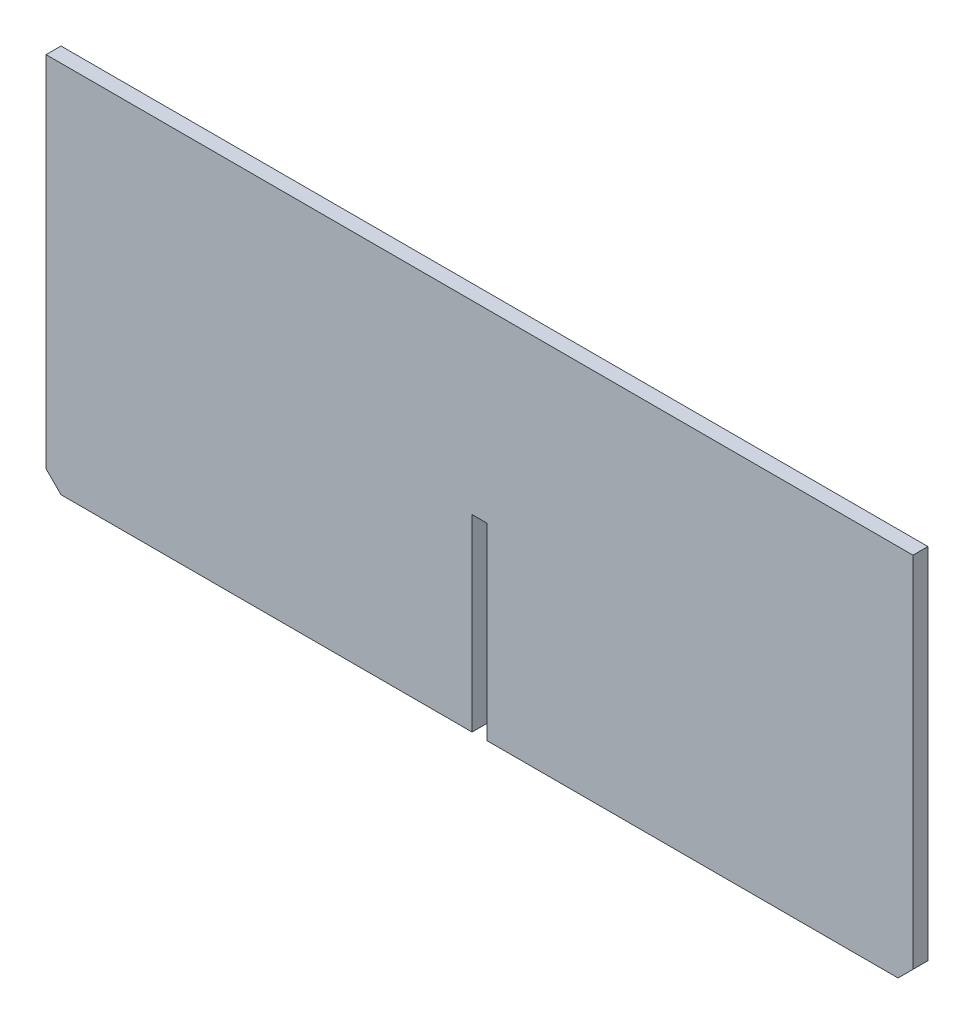
ISO-10303-21;
HEADER;
FILE_DESCRIPTION(('STEP AP214'),'2;1');
FILE_NAME('part.step','',(''),(''),'','','');
FILE_SCHEMA(('AUTOMOTIVE_DESIGN { 1 0 10303 214 1 1 1 1 }'));
ENDSEC;
DATA;
#1=APPLICATION_CONTEXT('core data for automotive mechanical design processes');
#2=APPLICATION_PROTOCOL_DEFINITION('international standard','automotive_design',2000,#1);
#3=PRODUCT_CONTEXT('',#1,'mechanical');
#4=PRODUCT('Part','Part','',(#3));
#5=PRODUCT_RELATED_PRODUCT_CATEGORY('part','',(#4));
#6=PRODUCT_DEFINITION_FORMATION('','',#4);
#7=PRODUCT_DEFINITION_CONTEXT('part definition',#1,'design');
#8=PRODUCT_DEFINITION('design','',#6,#7);
#9=PRODUCT_DEFINITION_SHAPE('','',#8);
#10=(LENGTH_UNIT() NAMED_UNIT(*) SI_UNIT(.MILLI.,.METRE.));
#11=(NAMED_UNIT(*) PLANE_ANGLE_UNIT() SI_UNIT($,.RADIAN.));
#12=(NAMED_UNIT(*) SI_UNIT($,.STERADIAN.) SOLID_ANGLE_UNIT());
#13=UNCERTAINTY_MEASURE_WITH_UNIT(LENGTH_MEASURE(1.E-05),#10,'distance_accuracy_value','');
#14=(GEOMETRIC_REPRESENTATION_CONTEXT(3) GLOBAL_UNCERTAINTY_ASSIGNED_CONTEXT((#13)) GLOBAL_UNIT_ASSIGNED_CONTEXT((#10,
#11,#12)) REPRESENTATION_CONTEXT('',''));
#15=CARTESIAN_POINT('',(0.,0.,0.));
#16=DIRECTION('',(0.,0.,1.));
#17=DIRECTION('',(1.,0.,0.));
#18=AXIS2_PLACEMENT_3D('',#15,#16,#17);
#19=CARTESIAN_POINT('',(0.,-50.,2.));
#20=DIRECTION('',(0.,1.,0.));
#21=DIRECTION('',(0.,0.,1.));
#22=AXIS2_PLACEMENT_3D('',#19,#20,#21);
#23=PLANE('',#22);
#24=DIRECTION('',(1.,0.,0.));
#25=VECTOR('',#24,1.);
#26=CARTESIAN_POINT('',(0.,-50.,2.));
#27=LINE('',#26,#25);
#28=CARTESIAN_POINT('',(59.,-50.,2.));
#29=VERTEX_POINT('',#28);
#30=CARTESIAN_POINT('',(114.,-50.,2.));
#31=VERTEX_POINT('',#30);
#32=EDGE_CURVE('E130',#29,#31,#27,.T.);
#33=ORIENTED_EDGE('',*,*,#32,.F.);
#34=DIRECTION('',(0.,0.,-1.));
#35=VECTOR('',#34,1.);
#36=CARTESIAN_POINT('',(59.,-50.,2.));
#37=LINE('',#36,#35);
#38=CARTESIAN_POINT('',(59.,-50.,0.));
#39=VERTEX_POINT('',#38);
#40=EDGE_CURVE('E116',#29,#39,#37,.T.);
#41=ORIENTED_EDGE('',*,*,#40,.T.);
#42=DIRECTION('',(1.,0.,0.));
#43=VECTOR('',#42,1.);
#44=CARTESIAN_POINT('',(0.,-50.,0.));
#45=LINE('',#44,#43);
#46=CARTESIAN_POINT('',(114.,-50.,0.));
#47=VERTEX_POINT('',#46);
#48=EDGE_CURVE('E154',#39,#47,#45,.T.);
#49=ORIENTED_EDGE('',*,*,#48,.T.);
#50=DIRECTION('',(0.,0.,1.));
#51=VECTOR('',#50,1.);
#52=CARTESIAN_POINT('',(114.,-50.,2.));
#53=LINE('',#52,#51);
#54=EDGE_CURVE('E138',#47,#31,#53,.T.);
#55=ORIENTED_EDGE('',*,*,#54,.T.);
#56=EDGE_LOOP('',(#33,#41,#49,#55));
#57=FACE_BOUND('',#56,.T.);
#58=ADVANCED_FACE('F37',(#57),#23,.F.);
#59=CARTESIAN_POINT('',(0.,0.,2.));
#60=DIRECTION('',(1.,0.,0.));
#61=DIRECTION('',(0.,1.,0.));
#62=AXIS2_PLACEMENT_3D('',#59,#60,#61);
#63=PLANE('',#62);
#64=DIRECTION('',(0.,-1.,0.));
#65=VECTOR('',#64,1.);
#66=CARTESIAN_POINT('',(0.,0.,0.));
#67=LINE('',#66,#65);
#68=CARTESIAN_POINT('',(0.,0.,0.));
#69=VERTEX_POINT('',#68);
#70=CARTESIAN_POINT('',(0.,-48.,0.));
#71=VERTEX_POINT('',#70);
#72=EDGE_CURVE('E152',#69,#71,#67,.T.);
#73=ORIENTED_EDGE('',*,*,#72,.T.);
#74=DIRECTION('',(0.,0.,1.));
#75=VECTOR('',#74,1.);
#76=CARTESIAN_POINT('',(0.,-48.,2.));
#77=LINE('',#76,#75);
#78=CARTESIAN_POINT('',(0.,-48.,2.));
#79=VERTEX_POINT('',#78);
#80=EDGE_CURVE('E11',#71,#79,#77,.T.);
#81=ORIENTED_EDGE('',*,*,#80,.T.);
#82=DIRECTION('',(0.,-1.,0.));
#83=VECTOR('',#82,1.);
#84=CARTESIAN_POINT('',(0.,0.,2.));
#85=LINE('',#84,#83);
#86=CARTESIAN_POINT('',(0.,0.,2.));
#87=VERTEX_POINT('',#86);
#88=EDGE_CURVE('E141',#87,#79,#85,.T.);
#89=ORIENTED_EDGE('',*,*,#88,.F.);
#90=DIRECTION('',(0.,0.,-1.));
#91=VECTOR('',#90,1.);
#92=CARTESIAN_POINT('',(0.,0.,2.));
#93=LINE('',#92,#91);
#94=EDGE_CURVE('E151',#87,#69,#93,.T.);
#95=ORIENTED_EDGE('',*,*,#94,.T.);
#96=EDGE_LOOP('',(#73,#81,#89,#95));
#97=FACE_BOUND('',#96,.T.);
#98=ADVANCED_FACE('F226',(#97),#63,.F.);
#99=CARTESIAN_POINT('',(1.99999999999999,-50.,0.));
#100=VERTEX_POINT('',#99);
#101=CARTESIAN_POINT('',(57.,-50.,0.));
#102=VERTEX_POINT('',#101);
#103=EDGE_CURVE('E156',#100,#102,#45,.T.);
#104=ORIENTED_EDGE('',*,*,#103,.T.);
#105=DIRECTION('',(0.,0.,-1.));
#106=VECTOR('',#105,1.);
#107=CARTESIAN_POINT('',(57.,-50.,2.));
#108=LINE('',#107,#106);
#109=CARTESIAN_POINT('',(57.,-50.,2.));
#110=VERTEX_POINT('',#109);
#111=EDGE_CURVE('E53',#110,#102,#108,.T.);
#112=ORIENTED_EDGE('',*,*,#111,.F.);
#113=CARTESIAN_POINT('',(1.99999999999999,-50.,2.));
#114=VERTEX_POINT('',#113);
#115=EDGE_CURVE('E140',#114,#110,#27,.T.);
#116=ORIENTED_EDGE('',*,*,#115,.F.);
#117=DIRECTION('',(0.,0.,-1.));
#118=VECTOR('',#117,1.);
#119=CARTESIAN_POINT('',(1.99999999999999,-50.,2.));
#120=LINE('',#119,#118);
#121=EDGE_CURVE('E175',#114,#100,#120,.T.);
#122=ORIENTED_EDGE('',*,*,#121,.T.);
#123=EDGE_LOOP('',(#104,#112,#116,#122));
#124=FACE_BOUND('',#123,.T.);
#125=ADVANCED_FACE('F202',(#124),#23,.F.);
#126=CARTESIAN_POINT('',(116.,0.,2.));
#127=DIRECTION('',(-1.,0.,0.));
#128=DIRECTION('',(0.,0.,1.));
#129=AXIS2_PLACEMENT_3D('',#126,#127,#128);
#130=PLANE('',#129);
#131=DIRECTION('',(0.,1.,0.));
#132=VECTOR('',#131,1.);
#133=CARTESIAN_POINT('',(116.,0.,2.));
#134=LINE('',#133,#132);
#135=CARTESIAN_POINT('',(116.,-48.,2.));
#136=VERTEX_POINT('',#135);
#137=CARTESIAN_POINT('',(116.,0.,2.));
#138=VERTEX_POINT('',#137);
#139=EDGE_CURVE('E144',#136,#138,#134,.T.);
#140=ORIENTED_EDGE('',*,*,#139,.F.);
#141=DIRECTION('',(0.,0.,-1.));
#142=VECTOR('',#141,1.);
#143=CARTESIAN_POINT('',(116.,-48.,2.));
#144=LINE('',#143,#142);
#145=CARTESIAN_POINT('',(116.,-48.,0.));
#146=VERTEX_POINT('',#145);
#147=EDGE_CURVE('E167',#136,#146,#144,.T.);
#148=ORIENTED_EDGE('',*,*,#147,.T.);
#149=DIRECTION('',(0.,1.,0.));
#150=VECTOR('',#149,1.);
#151=CARTESIAN_POINT('',(116.,0.,0.));
#152=LINE('',#151,#150);
#153=CARTESIAN_POINT('',(116.,0.,0.));
#154=VERTEX_POINT('',#153);
#155=EDGE_CURVE('E159',#146,#154,#152,.T.);
#156=ORIENTED_EDGE('',*,*,#155,.T.);
#157=DIRECTION('',(0.,0.,-1.));
#158=VECTOR('',#157,1.);
#159=CARTESIAN_POINT('',(116.,0.,2.));
#160=LINE('',#159,#158);
#161=EDGE_CURVE('E164',#138,#154,#160,.T.);
#162=ORIENTED_EDGE('',*,*,#161,.F.);
#163=EDGE_LOOP('',(#140,#148,#156,#162));
#164=FACE_BOUND('',#163,.T.);
#165=ADVANCED_FACE('F185',(#164),#130,.F.);
#166=CARTESIAN_POINT('',(0.,0.,2.));
#167=DIRECTION('',(0.,-1.,0.));
#168=DIRECTION('',(0.,0.,-1.));
#169=AXIS2_PLACEMENT_3D('',#166,#167,#168);
#170=PLANE('',#169);
#171=DIRECTION('',(-1.,0.,0.));
#172=VECTOR('',#171,1.);
#173=CARTESIAN_POINT('',(0.,0.,0.));
#174=LINE('',#173,#172);
#175=EDGE_CURVE('E145',#154,#69,#174,.T.);
#176=ORIENTED_EDGE('',*,*,#175,.T.);
#177=ORIENTED_EDGE('',*,*,#94,.F.);
#178=DIRECTION('',(-1.,0.,0.));
#179=VECTOR('',#178,1.);
#180=CARTESIAN_POINT('',(0.,0.,2.));
#181=LINE('',#180,#179);
#182=EDGE_CURVE('E149',#138,#87,#181,.T.);
#183=ORIENTED_EDGE('',*,*,#182,.F.);
#184=ORIENTED_EDGE('',*,*,#161,.T.);
#185=EDGE_LOOP('',(#176,#177,#183,#184));
#186=FACE_BOUND('',#185,.T.);
#187=ADVANCED_FACE('F194',(#186),#170,.F.);
#188=CARTESIAN_POINT('',(0.,0.,2.));
#189=DIRECTION('',(0.,0.,1.));
#190=DIRECTION('',(1.,0.,0.));
#191=AXIS2_PLACEMENT_3D('',#188,#189,#190);
#192=PLANE('',#191);
#193=DIRECTION('',(0.,-1.,0.));
#194=VECTOR('',#193,1.);
#195=CARTESIAN_POINT('',(59.,-50.,2.));
#196=LINE('',#195,#194);
#197=CARTESIAN_POINT('',(59.,-24.8,2.));
#198=VERTEX_POINT('',#197);
#199=EDGE_CURVE('E119',#198,#29,#196,.T.);
#200=ORIENTED_EDGE('',*,*,#199,.T.);
#201=ORIENTED_EDGE('',*,*,#32,.T.);
#202=DIRECTION('',(-0.70710678118655,-0.707106781186545,0.));
#203=VECTOR('',#202,1.);
#204=CARTESIAN_POINT('',(81.9999999999996,-82.0000000000002,2.));
#205=LINE('',#204,#203);
#206=EDGE_CURVE('E46',#31,#136,#205,.F.);
#207=ORIENTED_EDGE('',*,*,#206,.T.);
#208=ORIENTED_EDGE('',*,*,#139,.T.);
#209=ORIENTED_EDGE('',*,*,#182,.T.);
#210=ORIENTED_EDGE('',*,*,#88,.T.);
#211=DIRECTION('',(-0.707106781186545,0.70710678118655,0.));
#212=VECTOR('',#211,1.);
#213=CARTESIAN_POINT('',(-24.,-23.9999999999998,2.));
#214=LINE('',#213,#212);
#215=EDGE_CURVE('E179',#79,#114,#214,.F.);
#216=ORIENTED_EDGE('',*,*,#215,.T.);
#217=ORIENTED_EDGE('',*,*,#115,.T.);
#218=DIRECTION('',(0.,1.,0.));
#219=VECTOR('',#218,1.);
#220=CARTESIAN_POINT('',(57.,-50.,2.));
#221=LINE('',#220,#219);
#222=CARTESIAN_POINT('',(57.,-24.8,2.));
#223=VERTEX_POINT('',#222);
#224=EDGE_CURVE('E134',#110,#223,#221,.T.);
#225=ORIENTED_EDGE('',*,*,#224,.T.);
#226=DIRECTION('',(1.,0.,0.));
#227=VECTOR('',#226,1.);
#228=CARTESIAN_POINT('',(59.,-24.8,2.));
#229=LINE('',#228,#227);
#230=EDGE_CURVE('E126',#223,#198,#229,.T.);
#231=ORIENTED_EDGE('',*,*,#230,.T.);
#232=EDGE_LOOP('',(#200,#201,#207,#208,#209,#210,#216,#217,#225,#231));
#233=FACE_BOUND('',#232,.T.);
#234=ADVANCED_FACE('F129',(#233),#192,.T.);
#235=CARTESIAN_POINT('',(0.,0.,0.));
#236=DIRECTION('',(0.,0.,1.));
#237=DIRECTION('',(1.,0.,0.));
#238=AXIS2_PLACEMENT_3D('',#235,#236,#237);
#239=PLANE('',#238);
#240=ORIENTED_EDGE('',*,*,#48,.F.);
#241=DIRECTION('',(0.,-1.,0.));
#242=VECTOR('',#241,1.);
#243=CARTESIAN_POINT('',(59.,-50.,0.));
#244=LINE('',#243,#242);
#245=CARTESIAN_POINT('',(59.,-24.8,0.));
#246=VERTEX_POINT('',#245);
#247=EDGE_CURVE('E122',#246,#39,#244,.T.);
#248=ORIENTED_EDGE('',*,*,#247,.F.);
#249=DIRECTION('',(1.,0.,0.));
#250=VECTOR('',#249,1.);
#251=CARTESIAN_POINT('',(59.,-24.8,0.));
#252=LINE('',#251,#250);
#253=CARTESIAN_POINT('',(57.,-24.8,0.));
#254=VERTEX_POINT('',#253);
#255=EDGE_CURVE('E135',#254,#246,#252,.T.);
#256=ORIENTED_EDGE('',*,*,#255,.F.);
#257=DIRECTION('',(0.,1.,0.));
#258=VECTOR('',#257,1.);
#259=CARTESIAN_POINT('',(57.,-50.,0.));
#260=LINE('',#259,#258);
#261=EDGE_CURVE('E204',#102,#254,#260,.T.);
#262=ORIENTED_EDGE('',*,*,#261,.F.);
#263=ORIENTED_EDGE('',*,*,#103,.F.);
#264=DIRECTION('',(0.707106781186545,-0.70710678118655,0.));
#265=VECTOR('',#264,1.);
#266=CARTESIAN_POINT('',(1.99999999999999,-50.,0.));
#267=LINE('',#266,#265);
#268=EDGE_CURVE('E170',#100,#71,#267,.F.);
#269=ORIENTED_EDGE('',*,*,#268,.T.);
#270=ORIENTED_EDGE('',*,*,#72,.F.);
#271=ORIENTED_EDGE('',*,*,#175,.F.);
#272=ORIENTED_EDGE('',*,*,#155,.F.);
#273=DIRECTION('',(0.70710678118655,0.707106781186545,0.));
#274=VECTOR('',#273,1.);
#275=CARTESIAN_POINT('',(116.,-48.,0.));
#276=LINE('',#275,#274);
#277=EDGE_CURVE('E172',#146,#47,#276,.F.);
#278=ORIENTED_EDGE('',*,*,#277,.T.);
#279=EDGE_LOOP('',(#240,#248,#256,#262,#263,#269,#270,#271,#272,#278));
#280=FACE_BOUND('',#279,.T.);
#281=ADVANCED_FACE('F190',(#280),#239,.F.);
#282=CARTESIAN_POINT('',(116.,-48.,2.));
#283=DIRECTION('',(-0.707106781186545,0.70710678118655,0.));
#284=DIRECTION('',(0.,0.,-1.));
#285=AXIS2_PLACEMENT_3D('',#282,#283,#284);
#286=PLANE('',#285);
#287=ORIENTED_EDGE('',*,*,#206,.F.);
#288=ORIENTED_EDGE('',*,*,#54,.F.);
#289=ORIENTED_EDGE('',*,*,#277,.F.);
#290=ORIENTED_EDGE('',*,*,#147,.F.);
#291=EDGE_LOOP('',(#287,#288,#289,#290));
#292=FACE_BOUND('',#291,.T.);
#293=ADVANCED_FACE('F188',(#292),#286,.F.);
#294=CARTESIAN_POINT('',(1.99999999999999,-50.,2.));
#295=DIRECTION('',(0.70710678118655,0.707106781186545,0.));
#296=DIRECTION('',(0.,0.,-1.));
#297=AXIS2_PLACEMENT_3D('',#294,#295,#296);
#298=PLANE('',#297);
#299=ORIENTED_EDGE('',*,*,#215,.F.);
#300=ORIENTED_EDGE('',*,*,#80,.F.);
#301=ORIENTED_EDGE('',*,*,#268,.F.);
#302=ORIENTED_EDGE('',*,*,#121,.F.);
#303=EDGE_LOOP('',(#299,#300,#301,#302));
#304=FACE_BOUND('',#303,.T.);
#305=ADVANCED_FACE('F40',(#304),#298,.F.);
#306=CARTESIAN_POINT('',(59.,-50.,2.));
#307=DIRECTION('',(1.,0.,0.));
#308=DIRECTION('',(0.,0.,-1.));
#309=AXIS2_PLACEMENT_3D('',#306,#307,#308);
#310=PLANE('',#309);
#311=ORIENTED_EDGE('',*,*,#247,.T.);
#312=ORIENTED_EDGE('',*,*,#40,.F.);
#313=ORIENTED_EDGE('',*,*,#199,.F.);
#314=DIRECTION('',(0.,0.,-1.));
#315=VECTOR('',#314,1.);
#316=CARTESIAN_POINT('',(59.,-24.8,2.));
#317=LINE('',#316,#315);
#318=EDGE_CURVE('E155',#198,#246,#317,.T.);
#319=ORIENTED_EDGE('',*,*,#318,.T.);
#320=EDGE_LOOP('',(#311,#312,#313,#319));
#321=FACE_BOUND('',#320,.T.);
#322=ADVANCED_FACE('F118',(#321),#310,.F.);
#323=CARTESIAN_POINT('',(59.,-24.8,2.));
#324=DIRECTION('',(0.,1.,0.));
#325=DIRECTION('',(0.,0.,1.));
#326=AXIS2_PLACEMENT_3D('',#323,#324,#325);
#327=PLANE('',#326);
#328=ORIENTED_EDGE('',*,*,#255,.T.);
#329=ORIENTED_EDGE('',*,*,#318,.F.);
#330=ORIENTED_EDGE('',*,*,#230,.F.);
#331=DIRECTION('',(0.,0.,-1.));
#332=VECTOR('',#331,1.);
#333=CARTESIAN_POINT('',(57.,-24.8,2.));
#334=LINE('',#333,#332);
#335=EDGE_CURVE('E212',#223,#254,#334,.T.);
#336=ORIENTED_EDGE('',*,*,#335,.T.);
#337=EDGE_LOOP('',(#328,#329,#330,#336));
#338=FACE_BOUND('',#337,.T.);
#339=ADVANCED_FACE('F215',(#338),#327,.F.);
#340=CARTESIAN_POINT('',(57.,-50.,2.));
#341=DIRECTION('',(-1.,0.,0.));
#342=DIRECTION('',(0.,-1.,0.));
#343=AXIS2_PLACEMENT_3D('',#340,#341,#342);
#344=PLANE('',#343);
#345=ORIENTED_EDGE('',*,*,#261,.T.);
#346=ORIENTED_EDGE('',*,*,#335,.F.);
#347=ORIENTED_EDGE('',*,*,#224,.F.);
#348=ORIENTED_EDGE('',*,*,#111,.T.);
#349=EDGE_LOOP('',(#345,#346,#347,#348));
#350=FACE_BOUND('',#349,.T.);
#351=ADVANCED_FACE('F216',(#350),#344,.F.);
#352=CLOSED_SHELL('',(#58,#98,#125,#165,#187,#234,#281,#293,#305,#322,#339,#351));
#353=MANIFOLD_SOLID_BREP('B2',#352);
#354=ADVANCED_BREP_SHAPE_REPRESENTATION('',(#18,#353),#14);
#355=SHAPE_DEFINITION_REPRESENTATION(#9,#354);
ENDSEC;
END-ISO-10303-21;
